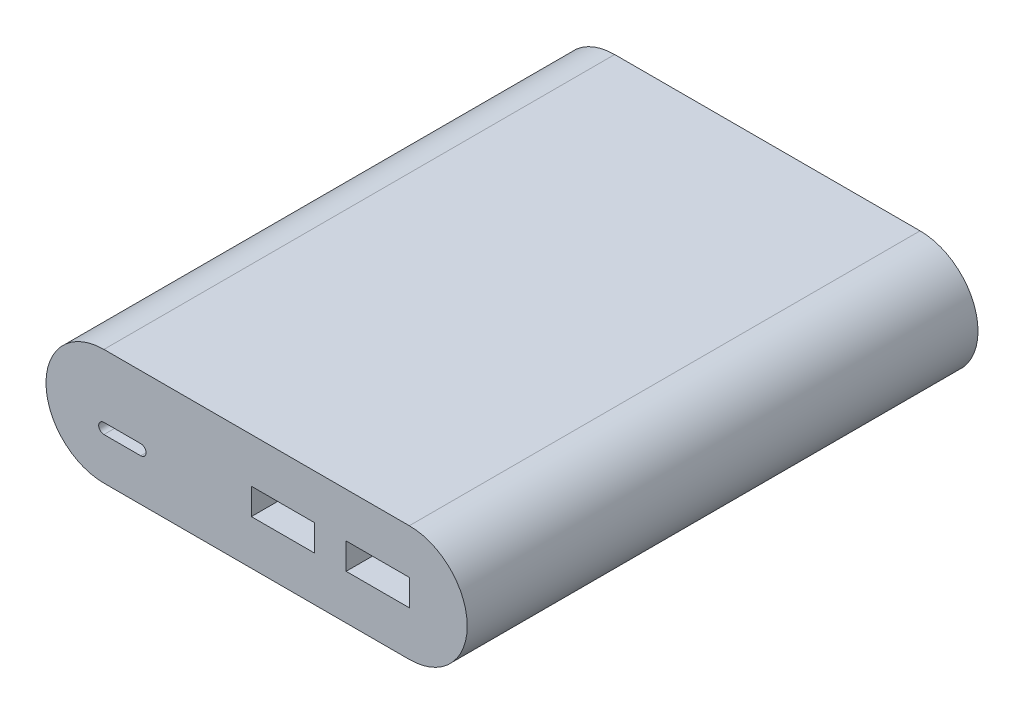
ISO-10303-21;
HEADER;
FILE_DESCRIPTION(('STEP AP214'),'2;1');
FILE_NAME('part.step','',(''),(''),'','','');
FILE_SCHEMA(('AUTOMOTIVE_DESIGN { 1 0 10303 214 1 1 1 1 }'));
ENDSEC;
DATA;
#1=APPLICATION_CONTEXT('core data for automotive mechanical design processes');
#2=APPLICATION_PROTOCOL_DEFINITION('international standard','automotive_design',2000,#1);
#3=PRODUCT_CONTEXT('',#1,'mechanical');
#4=PRODUCT('Part','Part','',(#3));
#5=PRODUCT_RELATED_PRODUCT_CATEGORY('part','',(#4));
#6=PRODUCT_DEFINITION_FORMATION('','',#4);
#7=PRODUCT_DEFINITION_CONTEXT('part definition',#1,'design');
#8=PRODUCT_DEFINITION('design','',#6,#7);
#9=PRODUCT_DEFINITION_SHAPE('','',#8);
#10=(LENGTH_UNIT() NAMED_UNIT(*) SI_UNIT(.MILLI.,.METRE.));
#11=(NAMED_UNIT(*) PLANE_ANGLE_UNIT() SI_UNIT($,.RADIAN.));
#12=(NAMED_UNIT(*) SI_UNIT($,.STERADIAN.) SOLID_ANGLE_UNIT());
#13=UNCERTAINTY_MEASURE_WITH_UNIT(LENGTH_MEASURE(1.E-05),#10,'distance_accuracy_value','');
#14=(GEOMETRIC_REPRESENTATION_CONTEXT(3) GLOBAL_UNCERTAINTY_ASSIGNED_CONTEXT((#13)) GLOBAL_UNIT_ASSIGNED_CONTEXT((#10,
#11,#12)) REPRESENTATION_CONTEXT('',''));
#15=CARTESIAN_POINT('',(0.,0.,0.));
#16=DIRECTION('',(0.,0.,1.));
#17=DIRECTION('',(1.,0.,0.));
#18=AXIS2_PLACEMENT_3D('',#15,#16,#17);
#19=CARTESIAN_POINT('',(0.,0.,97.));
#20=DIRECTION('',(0.,0.,-1.));
#21=DIRECTION('',(-1.,0.,0.));
#22=AXIS2_PLACEMENT_3D('',#19,#20,#21);
#23=CYLINDRICAL_SURFACE('',#22,11.);
#24=CARTESIAN_POINT('',(0.,0.,0.));
#25=DIRECTION('',(0.,0.,1.));
#26=DIRECTION('',(1.,0.,0.));
#27=AXIS2_PLACEMENT_3D('',#24,#25,#26);
#28=CIRCLE('',#27,11.);
#29=CARTESIAN_POINT('',(0.,11.,0.));
#30=VERTEX_POINT('',#29);
#31=CARTESIAN_POINT('',(0.,-11.,0.));
#32=VERTEX_POINT('',#31);
#33=EDGE_CURVE('E250',#30,#32,#28,.T.);
#34=ORIENTED_EDGE('',*,*,#33,.T.);
#35=DIRECTION('',(0.,0.,-1.));
#36=VECTOR('',#35,1.);
#37=CARTESIAN_POINT('',(0.,-11.,97.));
#38=LINE('',#37,#36);
#39=CARTESIAN_POINT('',(0.,-11.,97.));
#40=VERTEX_POINT('',#39);
#41=EDGE_CURVE('E11',#40,#32,#38,.T.);
#42=ORIENTED_EDGE('',*,*,#41,.F.);
#43=CARTESIAN_POINT('',(0.,0.,97.));
#44=DIRECTION('',(0.,0.,1.));
#45=DIRECTION('',(1.,0.,0.));
#46=AXIS2_PLACEMENT_3D('',#43,#44,#45);
#47=CIRCLE('',#46,11.);
#48=CARTESIAN_POINT('',(0.,11.,97.));
#49=VERTEX_POINT('',#48);
#50=EDGE_CURVE('E257',#49,#40,#47,.T.);
#51=ORIENTED_EDGE('',*,*,#50,.F.);
#52=DIRECTION('',(0.,0.,-1.));
#53=VECTOR('',#52,1.);
#54=CARTESIAN_POINT('',(0.,11.,97.));
#55=LINE('',#54,#53);
#56=EDGE_CURVE('E267',#49,#30,#55,.T.);
#57=ORIENTED_EDGE('',*,*,#56,.T.);
#58=EDGE_LOOP('',(#34,#42,#51,#57));
#59=FACE_BOUND('',#58,.T.);
#60=ADVANCED_FACE('F41',(#59),#23,.T.);
#61=CARTESIAN_POINT('',(0.,-11.,97.));
#62=DIRECTION('',(0.,1.,0.));
#63=DIRECTION('',(0.,0.,1.));
#64=AXIS2_PLACEMENT_3D('',#61,#62,#63);
#65=PLANE('',#64);
#66=DIRECTION('',(1.,0.,0.));
#67=VECTOR('',#66,1.);
#68=CARTESIAN_POINT('',(0.,-11.,0.));
#69=LINE('',#68,#67);
#70=CARTESIAN_POINT('',(58.,-11.,0.));
#71=VERTEX_POINT('',#70);
#72=EDGE_CURVE('E271',#32,#71,#69,.T.);
#73=ORIENTED_EDGE('',*,*,#72,.T.);
#74=DIRECTION('',(0.,0.,-1.));
#75=VECTOR('',#74,1.);
#76=CARTESIAN_POINT('',(58.,-11.,97.));
#77=LINE('',#76,#75);
#78=CARTESIAN_POINT('',(58.,-11.,97.));
#79=VERTEX_POINT('',#78);
#80=EDGE_CURVE('E49',#79,#71,#77,.T.);
#81=ORIENTED_EDGE('',*,*,#80,.F.);
#82=DIRECTION('',(1.,0.,0.));
#83=VECTOR('',#82,1.);
#84=CARTESIAN_POINT('',(0.,-11.,97.));
#85=LINE('',#84,#83);
#86=EDGE_CURVE('E260',#40,#79,#85,.T.);
#87=ORIENTED_EDGE('',*,*,#86,.F.);
#88=ORIENTED_EDGE('',*,*,#41,.T.);
#89=EDGE_LOOP('',(#73,#81,#87,#88));
#90=FACE_BOUND('',#89,.T.);
#91=ADVANCED_FACE('F305',(#90),#65,.F.);
#92=CARTESIAN_POINT('',(58.,0.,97.));
#93=DIRECTION('',(0.,0.,-1.));
#94=DIRECTION('',(-1.,0.,0.));
#95=AXIS2_PLACEMENT_3D('',#92,#93,#94);
#96=CYLINDRICAL_SURFACE('',#95,11.);
#97=CARTESIAN_POINT('',(58.,0.,0.));
#98=DIRECTION('',(0.,0.,1.));
#99=DIRECTION('',(1.,0.,0.));
#100=AXIS2_PLACEMENT_3D('',#97,#98,#99);
#101=CIRCLE('',#100,11.);
#102=CARTESIAN_POINT('',(58.,11.,0.));
#103=VERTEX_POINT('',#102);
#104=EDGE_CURVE('E274',#71,#103,#101,.T.);
#105=ORIENTED_EDGE('',*,*,#104,.T.);
#106=DIRECTION('',(0.,0.,-1.));
#107=VECTOR('',#106,1.);
#108=CARTESIAN_POINT('',(58.,11.,97.));
#109=LINE('',#108,#107);
#110=CARTESIAN_POINT('',(58.,11.,97.));
#111=VERTEX_POINT('',#110);
#112=EDGE_CURVE('E281',#111,#103,#109,.T.);
#113=ORIENTED_EDGE('',*,*,#112,.F.);
#114=CARTESIAN_POINT('',(58.,0.,97.));
#115=DIRECTION('',(0.,0.,1.));
#116=DIRECTION('',(1.,0.,0.));
#117=AXIS2_PLACEMENT_3D('',#114,#115,#116);
#118=CIRCLE('',#117,11.);
#119=EDGE_CURVE('E263',#79,#111,#118,.T.);
#120=ORIENTED_EDGE('',*,*,#119,.F.);
#121=ORIENTED_EDGE('',*,*,#80,.T.);
#122=EDGE_LOOP('',(#105,#113,#120,#121));
#123=FACE_BOUND('',#122,.T.);
#124=ADVANCED_FACE('F289',(#123),#96,.T.);
#125=CARTESIAN_POINT('',(0.,11.,97.));
#126=DIRECTION('',(0.,-1.,0.));
#127=DIRECTION('',(0.,0.,-1.));
#128=AXIS2_PLACEMENT_3D('',#125,#126,#127);
#129=PLANE('',#128);
#130=DIRECTION('',(-1.,0.,0.));
#131=VECTOR('',#130,1.);
#132=CARTESIAN_POINT('',(0.,11.,0.));
#133=LINE('',#132,#131);
#134=EDGE_CURVE('E261',#103,#30,#133,.T.);
#135=ORIENTED_EDGE('',*,*,#134,.T.);
#136=ORIENTED_EDGE('',*,*,#56,.F.);
#137=DIRECTION('',(-1.,0.,0.));
#138=VECTOR('',#137,1.);
#139=CARTESIAN_POINT('',(0.,11.,97.));
#140=LINE('',#139,#138);
#141=EDGE_CURVE('E265',#111,#49,#140,.T.);
#142=ORIENTED_EDGE('',*,*,#141,.F.);
#143=ORIENTED_EDGE('',*,*,#112,.T.);
#144=EDGE_LOOP('',(#135,#136,#142,#143));
#145=FACE_BOUND('',#144,.T.);
#146=ADVANCED_FACE('F298',(#145),#129,.F.);
#147=CARTESIAN_POINT('',(0.,0.,97.));
#148=DIRECTION('',(0.,0.,1.));
#149=DIRECTION('',(1.,0.,0.));
#150=AXIS2_PLACEMENT_3D('',#147,#148,#149);
#151=PLANE('',#150);
#152=DIRECTION('',(0.,1.,0.));
#153=VECTOR('',#152,1.);
#154=CARTESIAN_POINT('',(40.,-2.5,97.));
#155=LINE('',#154,#153);
#156=CARTESIAN_POINT('',(40.,-2.5,97.));
#157=VERTEX_POINT('',#156);
#158=CARTESIAN_POINT('',(40.,2.5,97.));
#159=VERTEX_POINT('',#158);
#160=EDGE_CURVE('E56',#157,#159,#155,.T.);
#161=ORIENTED_EDGE('',*,*,#160,.F.);
#162=DIRECTION('',(1.,0.,0.));
#163=VECTOR('',#162,1.);
#164=CARTESIAN_POINT('',(28.,-2.5,97.));
#165=LINE('',#164,#163);
#166=CARTESIAN_POINT('',(28.,-2.5,97.));
#167=VERTEX_POINT('',#166);
#168=EDGE_CURVE('E176',#167,#157,#165,.T.);
#169=ORIENTED_EDGE('',*,*,#168,.F.);
#170=DIRECTION('',(0.,-1.,0.));
#171=VECTOR('',#170,1.);
#172=CARTESIAN_POINT('',(28.,-2.5,97.));
#173=LINE('',#172,#171);
#174=CARTESIAN_POINT('',(28.,2.5,97.));
#175=VERTEX_POINT('',#174);
#176=EDGE_CURVE('E179',#175,#167,#173,.T.);
#177=ORIENTED_EDGE('',*,*,#176,.F.);
#178=DIRECTION('',(-1.,0.,0.));
#179=VECTOR('',#178,1.);
#180=CARTESIAN_POINT('',(28.,2.5,97.));
#181=LINE('',#180,#179);
#182=EDGE_CURVE('E185',#159,#175,#181,.T.);
#183=ORIENTED_EDGE('',*,*,#182,.F.);
#184=EDGE_LOOP('',(#161,#169,#177,#183));
#185=FACE_BOUND('',#184,.T.);
#186=DIRECTION('',(0.,1.,0.));
#187=VECTOR('',#186,1.);
#188=CARTESIAN_POINT('',(58.,-2.5,97.));
#189=LINE('',#188,#187);
#190=CARTESIAN_POINT('',(58.,-2.5,97.));
#191=VERTEX_POINT('',#190);
#192=CARTESIAN_POINT('',(58.,2.5,97.));
#193=VERTEX_POINT('',#192);
#194=EDGE_CURVE('E64',#191,#193,#189,.T.);
#195=ORIENTED_EDGE('',*,*,#194,.F.);
#196=DIRECTION('',(1.,0.,0.));
#197=VECTOR('',#196,1.);
#198=CARTESIAN_POINT('',(46.,-2.5,97.));
#199=LINE('',#198,#197);
#200=CARTESIAN_POINT('',(46.,-2.5,97.));
#201=VERTEX_POINT('',#200);
#202=EDGE_CURVE('E198',#201,#191,#199,.T.);
#203=ORIENTED_EDGE('',*,*,#202,.F.);
#204=DIRECTION('',(0.,-1.,0.));
#205=VECTOR('',#204,1.);
#206=CARTESIAN_POINT('',(46.,-2.5,97.));
#207=LINE('',#206,#205);
#208=CARTESIAN_POINT('',(46.,2.5,97.));
#209=VERTEX_POINT('',#208);
#210=EDGE_CURVE('E212',#209,#201,#207,.T.);
#211=ORIENTED_EDGE('',*,*,#210,.F.);
#212=DIRECTION('',(-1.,0.,0.));
#213=VECTOR('',#212,1.);
#214=CARTESIAN_POINT('',(46.,2.5,97.));
#215=LINE('',#214,#213);
#216=EDGE_CURVE('E209',#193,#209,#215,.T.);
#217=ORIENTED_EDGE('',*,*,#216,.F.);
#218=EDGE_LOOP('',(#195,#203,#211,#217));
#219=FACE_BOUND('',#218,.T.);
#220=CARTESIAN_POINT('',(0.,-2.,97.));
#221=DIRECTION('',(0.,0.,1.));
#222=DIRECTION('',(1.,0.,0.));
#223=AXIS2_PLACEMENT_3D('',#220,#221,#222);
#224=CIRCLE('',#223,1.);
#225=CARTESIAN_POINT('',(0.,-1.,97.));
#226=VERTEX_POINT('',#225);
#227=CARTESIAN_POINT('',(0.,-3.,97.));
#228=VERTEX_POINT('',#227);
#229=EDGE_CURVE('E219',#226,#228,#224,.T.);
#230=ORIENTED_EDGE('',*,*,#229,.F.);
#231=DIRECTION('',(-1.,0.,0.));
#232=VECTOR('',#231,1.);
#233=CARTESIAN_POINT('',(0.,-1.,97.));
#234=LINE('',#233,#232);
#235=CARTESIAN_POINT('',(7.,-1.,97.));
#236=VERTEX_POINT('',#235);
#237=EDGE_CURVE('E229',#236,#226,#234,.T.);
#238=ORIENTED_EDGE('',*,*,#237,.F.);
#239=CARTESIAN_POINT('',(7.,-2.,97.));
#240=DIRECTION('',(0.,0.,1.));
#241=DIRECTION('',(1.,0.,0.));
#242=AXIS2_PLACEMENT_3D('',#239,#240,#241);
#243=CIRCLE('',#242,1.);
#244=CARTESIAN_POINT('',(7.,-3.,97.));
#245=VERTEX_POINT('',#244);
#246=EDGE_CURVE('E243',#245,#236,#243,.T.);
#247=ORIENTED_EDGE('',*,*,#246,.F.);
#248=DIRECTION('',(1.,0.,0.));
#249=VECTOR('',#248,1.);
#250=CARTESIAN_POINT('',(0.,-3.,97.));
#251=LINE('',#250,#249);
#252=EDGE_CURVE('E240',#228,#245,#251,.T.);
#253=ORIENTED_EDGE('',*,*,#252,.F.);
#254=EDGE_LOOP('',(#230,#238,#247,#253));
#255=FACE_BOUND('',#254,.T.);
#256=ORIENTED_EDGE('',*,*,#50,.T.);
#257=ORIENTED_EDGE('',*,*,#86,.T.);
#258=ORIENTED_EDGE('',*,*,#119,.T.);
#259=ORIENTED_EDGE('',*,*,#141,.T.);
#260=EDGE_LOOP('',(#256,#257,#258,#259));
#261=FACE_BOUND('',#260,.T.);
#262=ADVANCED_FACE('F304',(#185,#219,#255,#261),#151,.T.);
#263=CARTESIAN_POINT('',(0.,0.,0.));
#264=DIRECTION('',(0.,0.,1.));
#265=DIRECTION('',(1.,0.,0.));
#266=AXIS2_PLACEMENT_3D('',#263,#264,#265);
#267=PLANE('',#266);
#268=ORIENTED_EDGE('',*,*,#33,.F.);
#269=ORIENTED_EDGE('',*,*,#134,.F.);
#270=ORIENTED_EDGE('',*,*,#104,.F.);
#271=ORIENTED_EDGE('',*,*,#72,.F.);
#272=EDGE_LOOP('',(#268,#269,#270,#271));
#273=FACE_BOUND('',#272,.T.);
#274=ADVANCED_FACE('F295',(#273),#267,.F.);
#275=CARTESIAN_POINT('',(0.,-2.,87.));
#276=DIRECTION('',(0.,0.,1.));
#277=DIRECTION('',(1.,0.,0.));
#278=AXIS2_PLACEMENT_3D('',#275,#276,#277);
#279=CYLINDRICAL_SURFACE('',#278,1.);
#280=ORIENTED_EDGE('',*,*,#229,.T.);
#281=DIRECTION('',(0.,0.,1.));
#282=VECTOR('',#281,1.);
#283=CARTESIAN_POINT('',(0.,-3.,87.));
#284=LINE('',#283,#282);
#285=CARTESIAN_POINT('',(0.,-3.,87.));
#286=VERTEX_POINT('',#285);
#287=EDGE_CURVE('E238',#286,#228,#284,.T.);
#288=ORIENTED_EDGE('',*,*,#287,.F.);
#289=CARTESIAN_POINT('',(0.,-2.,87.));
#290=DIRECTION('',(0.,0.,1.));
#291=DIRECTION('',(1.,0.,0.));
#292=AXIS2_PLACEMENT_3D('',#289,#290,#291);
#293=CIRCLE('',#292,1.);
#294=CARTESIAN_POINT('',(0.,-1.,87.));
#295=VERTEX_POINT('',#294);
#296=EDGE_CURVE('E225',#295,#286,#293,.T.);
#297=ORIENTED_EDGE('',*,*,#296,.F.);
#298=DIRECTION('',(0.,0.,1.));
#299=VECTOR('',#298,1.);
#300=CARTESIAN_POINT('',(0.,-1.,87.));
#301=LINE('',#300,#299);
#302=EDGE_CURVE('E248',#295,#226,#301,.T.);
#303=ORIENTED_EDGE('',*,*,#302,.T.);
#304=EDGE_LOOP('',(#280,#288,#297,#303));
#305=FACE_BOUND('',#304,.T.);
#306=ADVANCED_FACE('F317',(#305),#279,.F.);
#307=CARTESIAN_POINT('',(0.,-1.,87.));
#308=DIRECTION('',(0.,1.,0.));
#309=DIRECTION('',(0.,0.,1.));
#310=AXIS2_PLACEMENT_3D('',#307,#308,#309);
#311=PLANE('',#310);
#312=ORIENTED_EDGE('',*,*,#237,.T.);
#313=ORIENTED_EDGE('',*,*,#302,.F.);
#314=DIRECTION('',(-1.,0.,0.));
#315=VECTOR('',#314,1.);
#316=CARTESIAN_POINT('',(0.,-1.,87.));
#317=LINE('',#316,#315);
#318=CARTESIAN_POINT('',(7.,-1.,87.));
#319=VERTEX_POINT('',#318);
#320=EDGE_CURVE('E235',#319,#295,#317,.T.);
#321=ORIENTED_EDGE('',*,*,#320,.F.);
#322=DIRECTION('',(0.,0.,1.));
#323=VECTOR('',#322,1.);
#324=CARTESIAN_POINT('',(7.,-1.,87.));
#325=LINE('',#324,#323);
#326=EDGE_CURVE('E251',#319,#236,#325,.T.);
#327=ORIENTED_EDGE('',*,*,#326,.T.);
#328=EDGE_LOOP('',(#312,#313,#321,#327));
#329=FACE_BOUND('',#328,.T.);
#330=ADVANCED_FACE('F323',(#329),#311,.F.);
#331=CARTESIAN_POINT('',(7.,-2.,87.));
#332=DIRECTION('',(0.,0.,1.));
#333=DIRECTION('',(1.,0.,0.));
#334=AXIS2_PLACEMENT_3D('',#331,#332,#333);
#335=CYLINDRICAL_SURFACE('',#334,1.);
#336=ORIENTED_EDGE('',*,*,#246,.T.);
#337=ORIENTED_EDGE('',*,*,#326,.F.);
#338=CARTESIAN_POINT('',(7.,-2.,87.));
#339=DIRECTION('',(0.,0.,1.));
#340=DIRECTION('',(1.,0.,0.));
#341=AXIS2_PLACEMENT_3D('',#338,#339,#340);
#342=CIRCLE('',#341,1.);
#343=CARTESIAN_POINT('',(7.,-3.,87.));
#344=VERTEX_POINT('',#343);
#345=EDGE_CURVE('E232',#344,#319,#342,.T.);
#346=ORIENTED_EDGE('',*,*,#345,.F.);
#347=DIRECTION('',(0.,0.,1.));
#348=VECTOR('',#347,1.);
#349=CARTESIAN_POINT('',(7.,-3.,87.));
#350=LINE('',#349,#348);
#351=EDGE_CURVE('E253',#344,#245,#350,.T.);
#352=ORIENTED_EDGE('',*,*,#351,.T.);
#353=EDGE_LOOP('',(#336,#337,#346,#352));
#354=FACE_BOUND('',#353,.T.);
#355=ADVANCED_FACE('F329',(#354),#335,.F.);
#356=CARTESIAN_POINT('',(0.,-3.,87.));
#357=DIRECTION('',(0.,-1.,0.));
#358=DIRECTION('',(0.,0.,-1.));
#359=AXIS2_PLACEMENT_3D('',#356,#357,#358);
#360=PLANE('',#359);
#361=ORIENTED_EDGE('',*,*,#252,.T.);
#362=ORIENTED_EDGE('',*,*,#351,.F.);
#363=DIRECTION('',(1.,0.,0.));
#364=VECTOR('',#363,1.);
#365=CARTESIAN_POINT('',(0.,-3.,87.));
#366=LINE('',#365,#364);
#367=EDGE_CURVE('E228',#286,#344,#366,.T.);
#368=ORIENTED_EDGE('',*,*,#367,.F.);
#369=ORIENTED_EDGE('',*,*,#287,.T.);
#370=EDGE_LOOP('',(#361,#362,#368,#369));
#371=FACE_BOUND('',#370,.T.);
#372=ADVANCED_FACE('F325',(#371),#360,.F.);
#373=CARTESIAN_POINT('',(0.,-2.,87.));
#374=DIRECTION('',(0.,0.,1.));
#375=DIRECTION('',(1.,0.,0.));
#376=AXIS2_PLACEMENT_3D('',#373,#374,#375);
#377=PLANE('',#376);
#378=ORIENTED_EDGE('',*,*,#296,.T.);
#379=ORIENTED_EDGE('',*,*,#367,.T.);
#380=ORIENTED_EDGE('',*,*,#345,.T.);
#381=ORIENTED_EDGE('',*,*,#320,.T.);
#382=EDGE_LOOP('',(#378,#379,#380,#381));
#383=FACE_BOUND('',#382,.T.);
#384=ADVANCED_FACE('F328',(#383),#377,.T.);
#385=CARTESIAN_POINT('',(58.,-2.5,87.));
#386=DIRECTION('',(1.,0.,0.));
#387=DIRECTION('',(0.,0.,-1.));
#388=AXIS2_PLACEMENT_3D('',#385,#386,#387);
#389=PLANE('',#388);
#390=ORIENTED_EDGE('',*,*,#194,.T.);
#391=DIRECTION('',(0.,0.,1.));
#392=VECTOR('',#391,1.);
#393=CARTESIAN_POINT('',(58.,2.5,87.));
#394=LINE('',#393,#392);
#395=CARTESIAN_POINT('',(58.,2.5,87.));
#396=VERTEX_POINT('',#395);
#397=EDGE_CURVE('E207',#396,#193,#394,.T.);
#398=ORIENTED_EDGE('',*,*,#397,.F.);
#399=DIRECTION('',(0.,1.,0.));
#400=VECTOR('',#399,1.);
#401=CARTESIAN_POINT('',(58.,-2.5,87.));
#402=LINE('',#401,#400);
#403=CARTESIAN_POINT('',(58.,-2.5,87.));
#404=VERTEX_POINT('',#403);
#405=EDGE_CURVE('E194',#404,#396,#402,.T.);
#406=ORIENTED_EDGE('',*,*,#405,.F.);
#407=DIRECTION('',(0.,0.,1.));
#408=VECTOR('',#407,1.);
#409=CARTESIAN_POINT('',(58.,-2.5,87.));
#410=LINE('',#409,#408);
#411=EDGE_CURVE('E217',#404,#191,#410,.T.);
#412=ORIENTED_EDGE('',*,*,#411,.T.);
#413=EDGE_LOOP('',(#390,#398,#406,#412));
#414=FACE_BOUND('',#413,.T.);
#415=ADVANCED_FACE('F339',(#414),#389,.F.);
#416=CARTESIAN_POINT('',(46.,-2.5,87.));
#417=DIRECTION('',(0.,-1.,0.));
#418=DIRECTION('',(0.,0.,-1.));
#419=AXIS2_PLACEMENT_3D('',#416,#417,#418);
#420=PLANE('',#419);
#421=ORIENTED_EDGE('',*,*,#202,.T.);
#422=ORIENTED_EDGE('',*,*,#411,.F.);
#423=DIRECTION('',(1.,0.,0.));
#424=VECTOR('',#423,1.);
#425=CARTESIAN_POINT('',(46.,-2.5,87.));
#426=LINE('',#425,#424);
#427=CARTESIAN_POINT('',(46.,-2.5,87.));
#428=VERTEX_POINT('',#427);
#429=EDGE_CURVE('E204',#428,#404,#426,.T.);
#430=ORIENTED_EDGE('',*,*,#429,.F.);
#431=DIRECTION('',(0.,0.,1.));
#432=VECTOR('',#431,1.);
#433=CARTESIAN_POINT('',(46.,-2.5,87.));
#434=LINE('',#433,#432);
#435=EDGE_CURVE('E220',#428,#201,#434,.T.);
#436=ORIENTED_EDGE('',*,*,#435,.T.);
#437=EDGE_LOOP('',(#421,#422,#430,#436));
#438=FACE_BOUND('',#437,.T.);
#439=ADVANCED_FACE('F343',(#438),#420,.F.);
#440=CARTESIAN_POINT('',(46.,-2.5,87.));
#441=DIRECTION('',(-1.,0.,0.));
#442=DIRECTION('',(0.,0.,1.));
#443=AXIS2_PLACEMENT_3D('',#440,#441,#442);
#444=PLANE('',#443);
#445=ORIENTED_EDGE('',*,*,#210,.T.);
#446=ORIENTED_EDGE('',*,*,#435,.F.);
#447=DIRECTION('',(0.,-1.,0.));
#448=VECTOR('',#447,1.);
#449=CARTESIAN_POINT('',(46.,-2.5,87.));
#450=LINE('',#449,#448);
#451=CARTESIAN_POINT('',(46.,2.5,87.));
#452=VERTEX_POINT('',#451);
#453=EDGE_CURVE('E201',#452,#428,#450,.T.);
#454=ORIENTED_EDGE('',*,*,#453,.F.);
#455=DIRECTION('',(0.,0.,1.));
#456=VECTOR('',#455,1.);
#457=CARTESIAN_POINT('',(46.,2.5,87.));
#458=LINE('',#457,#456);
#459=EDGE_CURVE('E222',#452,#209,#458,.T.);
#460=ORIENTED_EDGE('',*,*,#459,.T.);
#461=EDGE_LOOP('',(#445,#446,#454,#460));
#462=FACE_BOUND('',#461,.T.);
#463=ADVANCED_FACE('F348',(#462),#444,.F.);
#464=CARTESIAN_POINT('',(46.,2.5,87.));
#465=DIRECTION('',(0.,1.,0.));
#466=DIRECTION('',(0.,0.,1.));
#467=AXIS2_PLACEMENT_3D('',#464,#465,#466);
#468=PLANE('',#467);
#469=ORIENTED_EDGE('',*,*,#216,.T.);
#470=ORIENTED_EDGE('',*,*,#459,.F.);
#471=DIRECTION('',(-1.,0.,0.));
#472=VECTOR('',#471,1.);
#473=CARTESIAN_POINT('',(46.,2.5,87.));
#474=LINE('',#473,#472);
#475=EDGE_CURVE('E197',#396,#452,#474,.T.);
#476=ORIENTED_EDGE('',*,*,#475,.F.);
#477=ORIENTED_EDGE('',*,*,#397,.T.);
#478=EDGE_LOOP('',(#469,#470,#476,#477));
#479=FACE_BOUND('',#478,.T.);
#480=ADVANCED_FACE('F344',(#479),#468,.F.);
#481=CARTESIAN_POINT('',(0.,0.,87.));
#482=DIRECTION('',(0.,0.,-1.));
#483=DIRECTION('',(-1.,0.,0.));
#484=AXIS2_PLACEMENT_3D('',#481,#482,#483);
#485=PLANE('',#484);
#486=ORIENTED_EDGE('',*,*,#405,.T.);
#487=ORIENTED_EDGE('',*,*,#475,.T.);
#488=ORIENTED_EDGE('',*,*,#453,.T.);
#489=ORIENTED_EDGE('',*,*,#429,.T.);
#490=EDGE_LOOP('',(#486,#487,#488,#489));
#491=FACE_BOUND('',#490,.T.);
#492=ADVANCED_FACE('F347',(#491),#485,.F.);
#493=CARTESIAN_POINT('',(40.,-2.5,87.));
#494=DIRECTION('',(1.,0.,0.));
#495=DIRECTION('',(0.,1.,0.));
#496=AXIS2_PLACEMENT_3D('',#493,#494,#495);
#497=PLANE('',#496);
#498=ORIENTED_EDGE('',*,*,#160,.T.);
#499=DIRECTION('',(0.,0.,1.));
#500=VECTOR('',#499,1.);
#501=CARTESIAN_POINT('',(40.,2.5,87.));
#502=LINE('',#501,#500);
#503=CARTESIAN_POINT('',(40.,2.5,87.));
#504=VERTEX_POINT('',#503);
#505=EDGE_CURVE('E154',#504,#159,#502,.T.);
#506=ORIENTED_EDGE('',*,*,#505,.F.);
#507=DIRECTION('',(0.,1.,0.));
#508=VECTOR('',#507,1.);
#509=CARTESIAN_POINT('',(40.,-2.5,87.));
#510=LINE('',#509,#508);
#511=CARTESIAN_POINT('',(40.,-2.5,87.));
#512=VERTEX_POINT('',#511);
#513=EDGE_CURVE('E158',#512,#504,#510,.T.);
#514=ORIENTED_EDGE('',*,*,#513,.F.);
#515=DIRECTION('',(0.,0.,1.));
#516=VECTOR('',#515,1.);
#517=CARTESIAN_POINT('',(40.,-2.5,87.));
#518=LINE('',#517,#516);
#519=EDGE_CURVE('E189',#512,#157,#518,.T.);
#520=ORIENTED_EDGE('',*,*,#519,.T.);
#521=EDGE_LOOP('',(#498,#506,#514,#520));
#522=FACE_BOUND('',#521,.T.);
#523=ADVANCED_FACE('F156',(#522),#497,.F.);
#524=CARTESIAN_POINT('',(28.,-2.5,87.));
#525=DIRECTION('',(0.,-1.,0.));
#526=DIRECTION('',(0.,0.,-1.));
#527=AXIS2_PLACEMENT_3D('',#524,#525,#526);
#528=PLANE('',#527);
#529=ORIENTED_EDGE('',*,*,#168,.T.);
#530=ORIENTED_EDGE('',*,*,#519,.F.);
#531=DIRECTION('',(1.,0.,0.));
#532=VECTOR('',#531,1.);
#533=CARTESIAN_POINT('',(28.,-2.5,87.));
#534=LINE('',#533,#532);
#535=CARTESIAN_POINT('',(28.,-2.5,87.));
#536=VERTEX_POINT('',#535);
#537=EDGE_CURVE('E164',#536,#512,#534,.T.);
#538=ORIENTED_EDGE('',*,*,#537,.F.);
#539=DIRECTION('',(0.,0.,1.));
#540=VECTOR('',#539,1.);
#541=CARTESIAN_POINT('',(28.,-2.5,87.));
#542=LINE('',#541,#540);
#543=EDGE_CURVE('E191',#536,#167,#542,.T.);
#544=ORIENTED_EDGE('',*,*,#543,.T.);
#545=EDGE_LOOP('',(#529,#530,#538,#544));
#546=FACE_BOUND('',#545,.T.);
#547=ADVANCED_FACE('F361',(#546),#528,.F.);
#548=CARTESIAN_POINT('',(28.,-2.5,87.));
#549=DIRECTION('',(-1.,0.,0.));
#550=DIRECTION('',(0.,0.,1.));
#551=AXIS2_PLACEMENT_3D('',#548,#549,#550);
#552=PLANE('',#551);
#553=ORIENTED_EDGE('',*,*,#176,.T.);
#554=ORIENTED_EDGE('',*,*,#543,.F.);
#555=DIRECTION('',(0.,-1.,0.));
#556=VECTOR('',#555,1.);
#557=CARTESIAN_POINT('',(28.,-2.5,87.));
#558=LINE('',#557,#556);
#559=CARTESIAN_POINT('',(28.,2.5,87.));
#560=VERTEX_POINT('',#559);
#561=EDGE_CURVE('E172',#560,#536,#558,.T.);
#562=ORIENTED_EDGE('',*,*,#561,.F.);
#563=DIRECTION('',(0.,0.,1.));
#564=VECTOR('',#563,1.);
#565=CARTESIAN_POINT('',(28.,2.5,87.));
#566=LINE('',#565,#564);
#567=EDGE_CURVE('E163',#560,#175,#566,.T.);
#568=ORIENTED_EDGE('',*,*,#567,.T.);
#569=EDGE_LOOP('',(#553,#554,#562,#568));
#570=FACE_BOUND('',#569,.T.);
#571=ADVANCED_FACE('F364',(#570),#552,.F.);
#572=CARTESIAN_POINT('',(28.,2.5,87.));
#573=DIRECTION('',(0.,1.,0.));
#574=DIRECTION('',(0.,0.,1.));
#575=AXIS2_PLACEMENT_3D('',#572,#573,#574);
#576=PLANE('',#575);
#577=ORIENTED_EDGE('',*,*,#182,.T.);
#578=ORIENTED_EDGE('',*,*,#567,.F.);
#579=DIRECTION('',(-1.,0.,0.));
#580=VECTOR('',#579,1.);
#581=CARTESIAN_POINT('',(28.,2.5,87.));
#582=LINE('',#581,#580);
#583=EDGE_CURVE('E167',#504,#560,#582,.T.);
#584=ORIENTED_EDGE('',*,*,#583,.F.);
#585=ORIENTED_EDGE('',*,*,#505,.T.);
#586=EDGE_LOOP('',(#577,#578,#584,#585));
#587=FACE_BOUND('',#586,.T.);
#588=ADVANCED_FACE('F168',(#587),#576,.F.);
#589=CARTESIAN_POINT('',(0.,0.,87.));
#590=DIRECTION('',(0.,0.,-1.));
#591=DIRECTION('',(-1.,0.,0.));
#592=AXIS2_PLACEMENT_3D('',#589,#590,#591);
#593=PLANE('',#592);
#594=ORIENTED_EDGE('',*,*,#513,.T.);
#595=ORIENTED_EDGE('',*,*,#583,.T.);
#596=ORIENTED_EDGE('',*,*,#561,.T.);
#597=ORIENTED_EDGE('',*,*,#537,.T.);
#598=EDGE_LOOP('',(#594,#595,#596,#597));
#599=FACE_BOUND('',#598,.T.);
#600=ADVANCED_FACE('F174',(#599),#593,.F.);
#601=CLOSED_SHELL('',(#60,#91,#124,#146,#262,#274,#306,#330,#355,#372,#384,#415,#439,#463,#480,
#492,#523,#547,#571,#588,#600));
#602=MANIFOLD_SOLID_BREP('B2',#601);
#603=ADVANCED_BREP_SHAPE_REPRESENTATION('',(#18,#602),#14);
#604=SHAPE_DEFINITION_REPRESENTATION(#9,#603);
ENDSEC;
END-ISO-10303-21;
